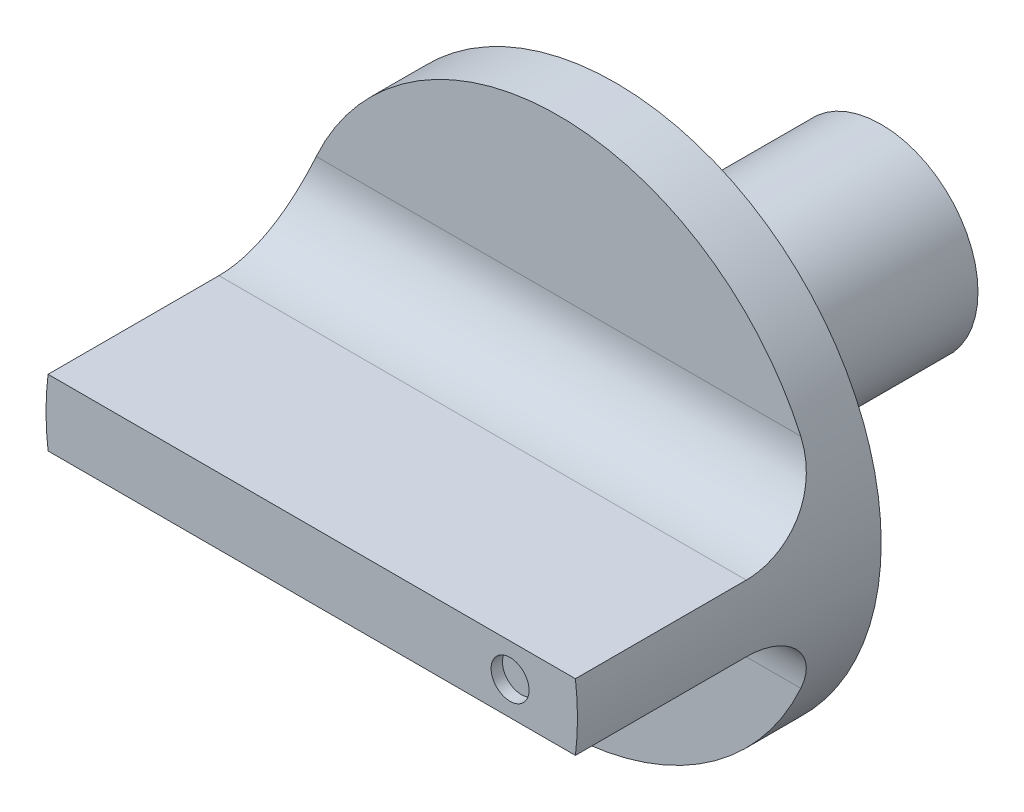
ISO-10303-21;
HEADER;
FILE_DESCRIPTION(('STEP AP214'),'2;1');
FILE_NAME('part.step','',(''),(''),'','','');
FILE_SCHEMA(('AUTOMOTIVE_DESIGN { 1 0 10303 214 1 1 1 1 }'));
ENDSEC;
DATA;
#1=APPLICATION_CONTEXT('core data for automotive mechanical design processes');
#2=APPLICATION_PROTOCOL_DEFINITION('international standard','automotive_design',2000,#1);
#3=PRODUCT_CONTEXT('',#1,'mechanical');
#4=PRODUCT('Part','Part','',(#3));
#5=PRODUCT_RELATED_PRODUCT_CATEGORY('part','',(#4));
#6=PRODUCT_DEFINITION_FORMATION('','',#4);
#7=PRODUCT_DEFINITION_CONTEXT('part definition',#1,'design');
#8=PRODUCT_DEFINITION('design','',#6,#7);
#9=PRODUCT_DEFINITION_SHAPE('','',#8);
#10=(LENGTH_UNIT() NAMED_UNIT(*) SI_UNIT(.MILLI.,.METRE.));
#11=(NAMED_UNIT(*) PLANE_ANGLE_UNIT() SI_UNIT($,.RADIAN.));
#12=(NAMED_UNIT(*) SI_UNIT($,.STERADIAN.) SOLID_ANGLE_UNIT());
#13=UNCERTAINTY_MEASURE_WITH_UNIT(LENGTH_MEASURE(1.E-05),#10,'distance_accuracy_value','');
#14=(GEOMETRIC_REPRESENTATION_CONTEXT(3) GLOBAL_UNCERTAINTY_ASSIGNED_CONTEXT((#13)) GLOBAL_UNIT_ASSIGNED_CONTEXT((#10,
#11,#12)) REPRESENTATION_CONTEXT('',''));
#15=CARTESIAN_POINT('',(0.,0.,0.));
#16=DIRECTION('',(0.,0.,1.));
#17=DIRECTION('',(1.,0.,0.));
#18=AXIS2_PLACEMENT_3D('',#15,#16,#17);
#19=CARTESIAN_POINT('',(0.,0.,0.));
#20=DIRECTION('',(0.,0.,1.));
#21=DIRECTION('',(1.,0.,0.));
#22=AXIS2_PLACEMENT_3D('',#19,#20,#21);
#23=PLANE('',#22);
#24=CARTESIAN_POINT('',(0.,0.,0.));
#25=DIRECTION('',(0.,0.,1.));
#26=DIRECTION('',(1.,0.,0.));
#27=AXIS2_PLACEMENT_3D('',#24,#25,#26);
#28=CIRCLE('',#27,8.1);
#29=CARTESIAN_POINT('',(8.1,0.,0.));
#30=VERTEX_POINT('',#29);
#31=EDGE_CURVE('E11',#30,#30,#28,.T.);
#32=ORIENTED_EDGE('',*,*,#31,.T.);
#33=EDGE_LOOP('',(#32));
#34=FACE_BOUND('',#33,.T.);
#35=CARTESIAN_POINT('',(0.,0.,0.));
#36=DIRECTION('',(0.,0.,1.));
#37=DIRECTION('',(1.,0.,0.));
#38=AXIS2_PLACEMENT_3D('',#35,#36,#37);
#39=CIRCLE('',#38,14.);
#40=CARTESIAN_POINT('',(14.,0.,0.));
#41=VERTEX_POINT('',#40);
#42=EDGE_CURVE('E143',#41,#41,#39,.T.);
#43=ORIENTED_EDGE('',*,*,#42,.F.);
#44=EDGE_LOOP('',(#43));
#45=FACE_BOUND('',#44,.T.);
#46=ADVANCED_FACE('F37',(#34,#45),#23,.F.);
#47=CARTESIAN_POINT('',(0.,0.,3.));
#48=DIRECTION('',(0.,0.,1.));
#49=DIRECTION('',(1.,0.,0.));
#50=AXIS2_PLACEMENT_3D('',#47,#48,#49);
#51=PLANE('',#50);
#52=CARTESIAN_POINT('',(0.,0.,3.));
#53=DIRECTION('',(0.,0.,1.));
#54=DIRECTION('',(1.,0.,0.));
#55=AXIS2_PLACEMENT_3D('',#52,#53,#54);
#56=CIRCLE('',#55,14.);
#57=CARTESIAN_POINT('',(12.7646974112197,5.75,3.));
#58=VERTEX_POINT('',#57);
#59=CARTESIAN_POINT('',(-12.7646974112197,5.75,3.));
#60=VERTEX_POINT('',#59);
#61=EDGE_CURVE('E154',#58,#60,#56,.T.);
#62=ORIENTED_EDGE('',*,*,#61,.T.);
#63=DIRECTION('',(-1.,0.,0.));
#64=VECTOR('',#63,1.);
#65=CARTESIAN_POINT('',(0.,5.75,3.));
#66=LINE('',#65,#64);
#67=EDGE_CURVE('E58',#60,#58,#66,.F.);
#68=ORIENTED_EDGE('',*,*,#67,.T.);
#69=EDGE_LOOP('',(#62,#68));
#70=FACE_BOUND('',#69,.T.);
#71=ADVANCED_FACE('F226',(#70),#51,.T.);
#72=CARTESIAN_POINT('',(0.,0.,3.));
#73=DIRECTION('',(0.,0.,-1.));
#74=DIRECTION('',(-1.,0.,0.));
#75=AXIS2_PLACEMENT_3D('',#72,#73,#74);
#76=CYLINDRICAL_SURFACE('',#75,14.);
#77=ORIENTED_EDGE('',*,*,#61,.F.);
#78=CARTESIAN_POINT('',(12.7646974112197,5.75,3.));
#79=CARTESIAN_POINT('',(12.8133424499844,5.64204335223538,2.99998928871641));
#80=CARTESIAN_POINT('',(12.8606029108377,5.53343825312185,3.0043706572603));
#81=CARTESIAN_POINT('',(12.9521304523054,5.31565370141964,3.02215339393863));
#82=CARTESIAN_POINT('',(12.9963962104835,5.2064740177411,3.03555871873419));
#83=CARTESIAN_POINT('',(13.0817394779418,4.98817355543458,3.07165627917164));
#84=CARTESIAN_POINT('',(13.1228114399877,4.87905319238212,3.09436426183639));
#85=CARTESIAN_POINT('',(13.2014972593165,4.66195155064684,3.14919727809361));
#86=CARTESIAN_POINT('',(13.2391116505054,4.55397009838477,3.18132085454332));
#87=CARTESIAN_POINT('',(13.3108824890513,4.33972493394002,3.2551366859237));
#88=CARTESIAN_POINT('',(13.3450277027999,4.23346768322963,3.29685868195494));
#89=CARTESIAN_POINT('',(13.4096750982265,4.02400638756288,3.38972723167851));
#90=CARTESIAN_POINT('',(13.4401773958802,3.92080224548669,3.44087348520886));
#91=CARTESIAN_POINT('',(13.4975283811932,3.71856994600999,3.55230462847356));
#92=CARTESIAN_POINT('',(13.5243817125624,3.61953659377169,3.61257769271428));
#93=CARTESIAN_POINT('',(13.5745767884513,3.42648697706038,3.74196566619452));
#94=CARTESIAN_POINT('',(13.5979187520637,3.33247039980081,3.81108002328098));
#95=CARTESIAN_POINT('',(13.6400616047314,3.15539921257272,3.9536501208695));
#96=CARTESIAN_POINT('',(13.6590416721592,3.0720260855453,4.02665784053624));
#97=CARTESIAN_POINT('',(13.6941993298864,2.91130130701874,4.179697076731));
#98=CARTESIAN_POINT('',(13.7103759690978,2.8339517039348,4.25973096312895));
#99=CARTESIAN_POINT('',(13.7401320649127,2.68597661762547,4.4262552318053));
#100=CARTESIAN_POINT('',(13.7537113800831,2.61535150067565,4.51274596532402));
#101=CARTESIAN_POINT('',(13.7785037692007,2.48142483079348,4.69155526745248));
#102=CARTESIAN_POINT('',(13.7897159941137,2.41812590930497,4.78387591177716));
#103=CARTESIAN_POINT('',(13.8197768846105,2.24227251491381,5.06505828087165));
#104=CARTESIAN_POINT('',(13.8356033516487,2.1408730483142,5.2614004982721));
#105=CARTESIAN_POINT('',(13.8607187424358,1.97175900445524,5.66829092108877));
#106=CARTESIAN_POINT('',(13.8700113757158,1.90402532013414,5.8788309912541));
#107=CARTESIAN_POINT('',(13.881303630132,1.81951457880177,6.24200420548069));
#108=CARTESIAN_POINT('',(13.8846679653311,1.79346835299963,6.39249988664667));
#109=CARTESIAN_POINT('',(13.8890975349593,1.75870711080202,6.69531316345105));
#110=CARTESIAN_POINT('',(13.8901657678749,1.74996949221797,6.84762812143153));
#111=CARTESIAN_POINT('',(13.8901943830891,1.75,7.));
#112=B_SPLINE_CURVE_WITH_KNOTS('',3,(#78,#79,#80,#81,#82,#83,#84,#85,#86,#87,#88,#89,#90,#91,
#92,#93,#94,#95,#96,#97,#98,#99,#100,#101,#102,#103,#104,#105,#106,#107,#108,#109,#110,#111),
.UNSPECIFIED.,.F.,.F.,(4,2,2,2,2,2,2,2,2,2,2,2,2,2,2,2,4),(0.,0.355173118166567,
0.71050206773962,1.06643500023452,1.42231287815554,1.77930867520821,2.13629310393352,
2.49281888884011,2.84932241899327,3.18621306732474,3.52321778599072,3.86024085045587,
4.19738459460411,4.85867106402948,5.519581789605,5.97693088002772,6.43368235318159),.UNSPECIFIED.);
#113=CARTESIAN_POINT('',(13.8901943830891,1.75,7.));
#114=VERTEX_POINT('',#113);
#115=EDGE_CURVE('E204',#58,#114,#112,.T.);
#116=ORIENTED_EDGE('',*,*,#115,.T.);
#117=DIRECTION('',(0.,0.,-1.));
#118=VECTOR('',#117,1.);
#119=CARTESIAN_POINT('',(13.8901943830891,1.75,16.));
#120=LINE('',#119,#118);
#121=CARTESIAN_POINT('',(13.8901943830891,1.75,16.));
#122=VERTEX_POINT('',#121);
#123=EDGE_CURVE('E278',#122,#114,#120,.T.);
#124=ORIENTED_EDGE('',*,*,#123,.F.);
#125=CARTESIAN_POINT('',(0.,0.,16.));
#126=DIRECTION('',(0.,0.,1.));
#127=DIRECTION('',(1.,0.,0.));
#128=AXIS2_PLACEMENT_3D('',#125,#126,#127);
#129=CIRCLE('',#128,14.);
#130=CARTESIAN_POINT('',(13.8901943830891,-1.75,16.));
#131=VERTEX_POINT('',#130);
#132=EDGE_CURVE('E138',#131,#122,#129,.T.);
#133=ORIENTED_EDGE('',*,*,#132,.F.);
#134=DIRECTION('',(0.,0.,-1.));
#135=VECTOR('',#134,1.);
#136=CARTESIAN_POINT('',(13.8901943830891,-1.75,16.));
#137=LINE('',#136,#135);
#138=CARTESIAN_POINT('',(13.8901943830891,-1.75,7.));
#139=VERTEX_POINT('',#138);
#140=EDGE_CURVE('E150',#131,#139,#137,.T.);
#141=ORIENTED_EDGE('',*,*,#140,.T.);
#142=CARTESIAN_POINT('',(13.8901943830891,-1.75,7.));
#143=CARTESIAN_POINT('',(13.890185903272,-1.74998758259612,6.88866587409843));
#144=CARTESIAN_POINT('',(13.889608507661,-1.75464771532613,6.77733304978259));
#145=CARTESIAN_POINT('',(13.8872545703268,-1.77322381971045,6.55545803267385));
#146=CARTESIAN_POINT('',(13.8854780627,-1.78713952818524,6.44491581749054));
#147=CARTESIAN_POINT('',(13.880665882577,-1.82412762233876,6.22546242215585));
#148=CARTESIAN_POINT('',(13.8776308851174,-1.84719509884925,6.11655039999122));
#149=CARTESIAN_POINT('',(13.8701837297043,-1.90230941575159,5.90107230724183));
#150=CARTESIAN_POINT('',(13.8657715943786,-1.93435610860528,5.79450619814222));
#151=CARTESIAN_POINT('',(13.855413758154,-2.00720229493654,5.58443282668332));
#152=CARTESIAN_POINT('',(13.8494673900458,-2.0480055951979,5.48092691703054));
#153=CARTESIAN_POINT('',(13.8358514398742,-2.13805714759255,5.2777274057792));
#154=CARTESIAN_POINT('',(13.8281812226378,-2.18730851092858,5.1780352252798));
#155=CARTESIAN_POINT('',(13.8109115224595,-2.29382440731986,4.98327946680829));
#156=CARTESIAN_POINT('',(13.8013131867418,-2.35108416927841,4.88821317803191));
#157=CARTESIAN_POINT('',(13.7799539983247,-2.47319820911891,4.70329566988036));
#158=CARTESIAN_POINT('',(13.7681923569512,-2.53805525359262,4.61344636822533));
#159=CARTESIAN_POINT('',(13.7423436759324,-2.67446883008973,4.44007539930171));
#160=CARTESIAN_POINT('',(13.7282684914239,-2.74599044142749,4.35652448661875));
#161=CARTESIAN_POINT('',(13.6975289047743,-2.89543111551641,4.19581008422588));
#162=CARTESIAN_POINT('',(13.6808635546214,-2.9733525156743,4.11864894911535));
#163=CARTESIAN_POINT('',(13.6447612739288,-3.13485734846068,3.9713088230282));
#164=CARTESIAN_POINT('',(13.6253259441231,-3.21843749643201,3.9011258389641));
#165=CARTESIAN_POINT('',(13.5835051904724,-3.39060996063691,3.76810933959038));
#166=CARTESIAN_POINT('',(13.5611186957287,-3.47920408961771,3.70527850787764));
#167=CARTESIAN_POINT('',(13.513391327788,-3.66018714482122,3.58762886938527));
#168=CARTESIAN_POINT('',(13.4880647397794,-3.75255641717657,3.53277401668241));
#169=CARTESIAN_POINT('',(13.4342943534781,-3.94072512299216,3.4309702623758));
#170=CARTESIAN_POINT('',(13.4058493949619,-4.03652582416611,3.3840243199596));
#171=CARTESIAN_POINT('',(13.3458230422065,-4.23076041808268,3.2982190730414));
#172=CARTESIAN_POINT('',(13.3142409679559,-4.32919487833409,3.25936152748179));
#173=CARTESIAN_POINT('',(13.24798601634,-4.52789819168774,3.18980785800911));
#174=CARTESIAN_POINT('',(13.2133121728158,-4.62816761036863,3.1591142973097));
#175=CARTESIAN_POINT('',(13.1162936594352,-4.89848299299658,3.08776470183214));
#176=CARTESIAN_POINT('',(13.0511759463316,-5.06957848692445,3.05454308171097));
#177=CARTESIAN_POINT('',(12.947810115637,-5.32566664340295,3.02163845443137));
#178=CARTESIAN_POINT('',(12.9124400681924,-5.41086252052081,3.01349129441037));
#179=CARTESIAN_POINT('',(12.8398964948102,-5.58082349877243,3.00267398153743));
#180=CARTESIAN_POINT('',(12.8027231701248,-5.66558864681592,3.00000321893317));
#181=CARTESIAN_POINT('',(12.7646974112197,-5.75,3.));
#182=B_SPLINE_CURVE_WITH_KNOTS('',3,(#142,#143,#144,#145,#146,#147,#148,#149,#150,#151,#152,
#153,#154,#155,#156,#157,#158,#159,#160,#161,#162,#163,#164,#165,#166,#167,#168,#169,#170,#171,
#172,#173,#174,#175,#176,#177,#178,#179,#180,#181),.UNSPECIFIED.,.F.,.F.,(4,2,2,2,2,2,2,2,2,2,2,
2,2,2,2,2,2,2,2,4),(0.,0.333901638520549,0.667793783054302,1.00150706364846,1.33521486129735,
1.66906802759402,2.00304440837511,2.33682265973875,2.67072283835595,3.00296252356278,
3.33532409754742,3.66749437722826,3.99978552610337,4.33052487360657,4.66138769658836,
4.99232239562323,5.32336087458255,5.87967412396052,6.15734509600004,6.43498514995604),.UNSPECIFIED.);
#183=CARTESIAN_POINT('',(12.7646974112197,-5.75,3.));
#184=VERTEX_POINT('',#183);
#185=EDGE_CURVE('E170',#139,#184,#182,.T.);
#186=ORIENTED_EDGE('',*,*,#185,.T.);
#187=CARTESIAN_POINT('',(-12.7646974112197,-5.75,3.));
#188=VERTEX_POINT('',#187);
#189=EDGE_CURVE('E146',#188,#184,#56,.T.);
#190=ORIENTED_EDGE('',*,*,#189,.F.);
#191=CARTESIAN_POINT('',(-12.7646974112197,-5.75,3.));
#192=CARTESIAN_POINT('',(-12.8133424499844,-5.64204335223538,2.99998928871641));
#193=CARTESIAN_POINT('',(-12.8606029108377,-5.53343825312185,3.0043706572603));
#194=CARTESIAN_POINT('',(-12.9521304523054,-5.31565370141964,3.02215339393863));
#195=CARTESIAN_POINT('',(-12.9963962104835,-5.2064740177411,3.03555871873419));
#196=CARTESIAN_POINT('',(-13.0817394779418,-4.98817355543458,3.07165627917164));
#197=CARTESIAN_POINT('',(-13.1228114399877,-4.87905319238212,3.09436426183639));
#198=CARTESIAN_POINT('',(-13.2014972593165,-4.66195155064684,3.14919727809361));
#199=CARTESIAN_POINT('',(-13.2391116505054,-4.55397009838477,3.18132085454332));
#200=CARTESIAN_POINT('',(-13.3108824890513,-4.33972493394002,3.2551366859237));
#201=CARTESIAN_POINT('',(-13.3450277027999,-4.23346768322963,3.29685868195494));
#202=CARTESIAN_POINT('',(-13.4096750982265,-4.02400638756288,3.38972723167851));
#203=CARTESIAN_POINT('',(-13.4401773958802,-3.92080224548669,3.44087348520886));
#204=CARTESIAN_POINT('',(-13.4975283811932,-3.71856994600999,3.55230462847356));
#205=CARTESIAN_POINT('',(-13.5243817125624,-3.61953659377169,3.61257769271428));
#206=CARTESIAN_POINT('',(-13.5745767884513,-3.42648697706038,3.74196566619452));
#207=CARTESIAN_POINT('',(-13.5979187520637,-3.33247039980081,3.81108002328098));
#208=CARTESIAN_POINT('',(-13.6400616047314,-3.15539921257272,3.9536501208695));
#209=CARTESIAN_POINT('',(-13.6590416721592,-3.0720260855453,4.02665784053624));
#210=CARTESIAN_POINT('',(-13.6941993298864,-2.91130130701874,4.179697076731));
#211=CARTESIAN_POINT('',(-13.7103759690978,-2.8339517039348,4.25973096312895));
#212=CARTESIAN_POINT('',(-13.7401320649127,-2.68597661762547,4.4262552318053));
#213=CARTESIAN_POINT('',(-13.7537113800831,-2.61535150067565,4.51274596532402));
#214=CARTESIAN_POINT('',(-13.7785037692007,-2.48142483079348,4.69155526745248));
#215=CARTESIAN_POINT('',(-13.7897159941137,-2.41812590930497,4.78387591177716));
#216=CARTESIAN_POINT('',(-13.8197768846105,-2.24227251491381,5.06505828087165));
#217=CARTESIAN_POINT('',(-13.8356033516487,-2.1408730483142,5.2614004982721));
#218=CARTESIAN_POINT('',(-13.8607187424358,-1.97175900445524,5.66829092108877));
#219=CARTESIAN_POINT('',(-13.8700113757158,-1.90402532013414,5.8788309912541));
#220=CARTESIAN_POINT('',(-13.881303630132,-1.81951457880177,6.24200420548069));
#221=CARTESIAN_POINT('',(-13.8846679653311,-1.79346835299963,6.39249988664667));
#222=CARTESIAN_POINT('',(-13.8890975349593,-1.75870711080202,6.69531316345105));
#223=CARTESIAN_POINT('',(-13.8901657678749,-1.74996949221797,6.84762812143153));
#224=CARTESIAN_POINT('',(-13.8901943830891,-1.75,7.));
#225=B_SPLINE_CURVE_WITH_KNOTS('',3,(#191,#192,#193,#194,#195,#196,#197,#198,#199,#200,#201,
#202,#203,#204,#205,#206,#207,#208,#209,#210,#211,#212,#213,#214,#215,#216,#217,#218,#219,#220,
#221,#222,#223,#224),.UNSPECIFIED.,.F.,.F.,(4,2,2,2,2,2,2,2,2,2,2,2,2,2,2,2,4),(0.,
0.355173118166567,0.71050206773962,1.06643500023452,1.42231287815554,1.77930867520821,
2.13629310393352,2.49281888884011,2.84932241899327,3.18621306732474,3.52321778599072,
3.86024085045587,4.19738459460411,4.85867106402948,5.519581789605,5.97693088002772,
6.43368235318159),.UNSPECIFIED.);
#226=CARTESIAN_POINT('',(-13.8901943830891,-1.75,7.));
#227=VERTEX_POINT('',#226);
#228=EDGE_CURVE('E171',#188,#227,#225,.T.);
#229=ORIENTED_EDGE('',*,*,#228,.T.);
#230=DIRECTION('',(0.,0.,-1.));
#231=VECTOR('',#230,1.);
#232=CARTESIAN_POINT('',(-13.8901943830891,-1.75,16.));
#233=LINE('',#232,#231);
#234=CARTESIAN_POINT('',(-13.8901943830891,-1.75,16.));
#235=VERTEX_POINT('',#234);
#236=EDGE_CURVE('E147',#235,#227,#233,.T.);
#237=ORIENTED_EDGE('',*,*,#236,.F.);
#238=CARTESIAN_POINT('',(0.,0.,16.));
#239=DIRECTION('',(0.,0.,1.));
#240=DIRECTION('',(1.,0.,0.));
#241=AXIS2_PLACEMENT_3D('',#238,#239,#240);
#242=CIRCLE('',#241,14.);
#243=CARTESIAN_POINT('',(-13.8901943830891,1.75,16.));
#244=VERTEX_POINT('',#243);
#245=EDGE_CURVE('E133',#244,#235,#242,.T.);
#246=ORIENTED_EDGE('',*,*,#245,.F.);
#247=DIRECTION('',(0.,0.,-1.));
#248=VECTOR('',#247,1.);
#249=CARTESIAN_POINT('',(-13.8901943830891,1.75,16.));
#250=LINE('',#249,#248);
#251=CARTESIAN_POINT('',(-13.8901943830891,1.75,7.));
#252=VERTEX_POINT('',#251);
#253=EDGE_CURVE('E142',#244,#252,#250,.T.);
#254=ORIENTED_EDGE('',*,*,#253,.T.);
#255=CARTESIAN_POINT('',(-13.8901943830891,1.75,7.));
#256=CARTESIAN_POINT('',(-13.890185903272,1.74998758259612,6.88866587409843));
#257=CARTESIAN_POINT('',(-13.889608507661,1.75464771532613,6.77733304978259));
#258=CARTESIAN_POINT('',(-13.8872545703268,1.77322381971045,6.55545803267385));
#259=CARTESIAN_POINT('',(-13.8854780627,1.78713952818524,6.44491581749054));
#260=CARTESIAN_POINT('',(-13.880665882577,1.82412762233876,6.22546242215585));
#261=CARTESIAN_POINT('',(-13.8776308851174,1.84719509884925,6.11655039999122));
#262=CARTESIAN_POINT('',(-13.8701837297043,1.90230941575159,5.90107230724183));
#263=CARTESIAN_POINT('',(-13.8657715943786,1.93435610860528,5.79450619814222));
#264=CARTESIAN_POINT('',(-13.855413758154,2.00720229493654,5.58443282668332));
#265=CARTESIAN_POINT('',(-13.8494673900458,2.0480055951979,5.48092691703054));
#266=CARTESIAN_POINT('',(-13.8358514398742,2.13805714759255,5.2777274057792));
#267=CARTESIAN_POINT('',(-13.8281812226378,2.18730851092858,5.1780352252798));
#268=CARTESIAN_POINT('',(-13.8109115224595,2.29382440731986,4.98327946680829));
#269=CARTESIAN_POINT('',(-13.8013131867418,2.35108416927841,4.88821317803191));
#270=CARTESIAN_POINT('',(-13.7799539983247,2.47319820911891,4.70329566988036));
#271=CARTESIAN_POINT('',(-13.7681923569512,2.53805525359262,4.61344636822533));
#272=CARTESIAN_POINT('',(-13.7423436759324,2.67446883008973,4.44007539930171));
#273=CARTESIAN_POINT('',(-13.7282684914239,2.74599044142749,4.35652448661875));
#274=CARTESIAN_POINT('',(-13.6975289047743,2.89543111551641,4.19581008422588));
#275=CARTESIAN_POINT('',(-13.6808635546214,2.9733525156743,4.11864894911535));
#276=CARTESIAN_POINT('',(-13.6447612739288,3.13485734846068,3.9713088230282));
#277=CARTESIAN_POINT('',(-13.6253259441231,3.21843749643201,3.9011258389641));
#278=CARTESIAN_POINT('',(-13.5835051904724,3.39060996063691,3.76810933959038));
#279=CARTESIAN_POINT('',(-13.5611186957287,3.47920408961771,3.70527850787764));
#280=CARTESIAN_POINT('',(-13.513391327788,3.66018714482122,3.58762886938527));
#281=CARTESIAN_POINT('',(-13.4880647397794,3.75255641717657,3.53277401668241));
#282=CARTESIAN_POINT('',(-13.4342943534781,3.94072512299216,3.4309702623758));
#283=CARTESIAN_POINT('',(-13.4058493949619,4.03652582416611,3.3840243199596));
#284=CARTESIAN_POINT('',(-13.3458230422065,4.23076041808268,3.2982190730414));
#285=CARTESIAN_POINT('',(-13.3142409679559,4.32919487833409,3.25936152748179));
#286=CARTESIAN_POINT('',(-13.24798601634,4.52789819168774,3.18980785800911));
#287=CARTESIAN_POINT('',(-13.2133121728158,4.62816761036863,3.1591142973097));
#288=CARTESIAN_POINT('',(-13.1162936594352,4.89848299299658,3.08776470183214));
#289=CARTESIAN_POINT('',(-13.0511759463316,5.06957848692445,3.05454308171097));
#290=CARTESIAN_POINT('',(-12.947810115637,5.32566664340295,3.02163845443137));
#291=CARTESIAN_POINT('',(-12.9124400681924,5.41086252052081,3.01349129441037));
#292=CARTESIAN_POINT('',(-12.8398964948102,5.58082349877243,3.00267398153743));
#293=CARTESIAN_POINT('',(-12.8027231701248,5.66558864681592,3.00000321893317));
#294=CARTESIAN_POINT('',(-12.7646974112197,5.75,3.));
#295=B_SPLINE_CURVE_WITH_KNOTS('',3,(#255,#256,#257,#258,#259,#260,#261,#262,#263,#264,#265,
#266,#267,#268,#269,#270,#271,#272,#273,#274,#275,#276,#277,#278,#279,#280,#281,#282,#283,#284,
#285,#286,#287,#288,#289,#290,#291,#292,#293,#294),.UNSPECIFIED.,.F.,.F.,(4,2,2,2,2,2,2,2,2,2,2,
2,2,2,2,2,2,2,2,4),(0.,0.333901638520549,0.667793783054302,1.00150706364846,1.33521486129735,
1.66906802759402,2.00304440837511,2.33682265973875,2.67072283835595,3.00296252356278,
3.33532409754742,3.66749437722826,3.99978552610337,4.33052487360657,4.66138769658836,
4.99232239562323,5.32336087458255,5.87967412396052,6.15734509600004,6.43498514995604),.UNSPECIFIED.);
#296=EDGE_CURVE('E52',#252,#60,#295,.T.);
#297=ORIENTED_EDGE('',*,*,#296,.T.);
#298=EDGE_LOOP('',(#77,#116,#124,#133,#141,#186,#190,#229,#237,#246,#254,#297));
#299=FACE_BOUND('',#298,.T.);
#300=ORIENTED_EDGE('',*,*,#42,.T.);
#301=EDGE_LOOP('',(#300));
#302=FACE_BOUND('',#301,.T.);
#303=ADVANCED_FACE('F185',(#299,#302),#76,.T.);
#304=ORIENTED_EDGE('',*,*,#189,.T.);
#305=DIRECTION('',(1.,0.,0.));
#306=VECTOR('',#305,1.);
#307=CARTESIAN_POINT('',(0.,-5.75,3.));
#308=LINE('',#307,#306);
#309=EDGE_CURVE('E163',#184,#188,#308,.F.);
#310=ORIENTED_EDGE('',*,*,#309,.T.);
#311=EDGE_LOOP('',(#304,#310));
#312=FACE_BOUND('',#311,.T.);
#313=ADVANCED_FACE('F232',(#312),#51,.T.);
#314=CARTESIAN_POINT('',(-13.8901943830891,-1.75,16.));
#315=DIRECTION('',(0.,1.,0.));
#316=DIRECTION('',(0.,0.,1.));
#317=AXIS2_PLACEMENT_3D('',#314,#315,#316);
#318=PLANE('',#317);
#319=ORIENTED_EDGE('',*,*,#236,.T.);
#320=DIRECTION('',(1.,0.,0.));
#321=VECTOR('',#320,1.);
#322=CARTESIAN_POINT('',(-13.8901943830891,-1.75,7.));
#323=LINE('',#322,#321);
#324=EDGE_CURVE('E161',#227,#139,#323,.T.);
#325=ORIENTED_EDGE('',*,*,#324,.T.);
#326=ORIENTED_EDGE('',*,*,#140,.F.);
#327=DIRECTION('',(1.,0.,0.));
#328=VECTOR('',#327,1.);
#329=CARTESIAN_POINT('',(-13.8901943830891,-1.75,16.));
#330=LINE('',#329,#328);
#331=EDGE_CURVE('E136',#235,#131,#330,.T.);
#332=ORIENTED_EDGE('',*,*,#331,.F.);
#333=EDGE_LOOP('',(#319,#325,#326,#332));
#334=FACE_BOUND('',#333,.T.);
#335=ADVANCED_FACE('F258',(#334),#318,.F.);
#336=CARTESIAN_POINT('',(-13.8901943830891,1.75,16.));
#337=DIRECTION('',(0.,-1.,0.));
#338=DIRECTION('',(0.,0.,-1.));
#339=AXIS2_PLACEMENT_3D('',#336,#337,#338);
#340=PLANE('',#339);
#341=ORIENTED_EDGE('',*,*,#123,.T.);
#342=DIRECTION('',(-1.,0.,0.));
#343=VECTOR('',#342,1.);
#344=CARTESIAN_POINT('',(-13.8901943830891,1.75,7.));
#345=LINE('',#344,#343);
#346=EDGE_CURVE('E164',#114,#252,#345,.T.);
#347=ORIENTED_EDGE('',*,*,#346,.T.);
#348=ORIENTED_EDGE('',*,*,#253,.F.);
#349=DIRECTION('',(-1.,0.,0.));
#350=VECTOR('',#349,1.);
#351=CARTESIAN_POINT('',(-13.8901943830891,1.75,16.));
#352=LINE('',#351,#350);
#353=EDGE_CURVE('E140',#122,#244,#352,.T.);
#354=ORIENTED_EDGE('',*,*,#353,.F.);
#355=EDGE_LOOP('',(#341,#347,#348,#354));
#356=FACE_BOUND('',#355,.T.);
#357=ADVANCED_FACE('F254',(#356),#340,.F.);
#358=CARTESIAN_POINT('',(0.,0.,16.));
#359=DIRECTION('',(0.,0.,1.));
#360=DIRECTION('',(1.,0.,0.));
#361=AXIS2_PLACEMENT_3D('',#358,#359,#360);
#362=PLANE('',#361);
#363=CARTESIAN_POINT('',(10.4486518787609,0.,16.));
#364=DIRECTION('',(0.,0.,1.));
#365=DIRECTION('',(1.,0.,0.));
#366=AXIS2_PLACEMENT_3D('',#363,#364,#365);
#367=CIRCLE('',#366,1.);
#368=CARTESIAN_POINT('',(11.4486518787609,0.,16.));
#369=VERTEX_POINT('',#368);
#370=EDGE_CURVE('E124',#369,#369,#367,.T.);
#371=ORIENTED_EDGE('',*,*,#370,.F.);
#372=EDGE_LOOP('',(#371));
#373=FACE_BOUND('',#372,.T.);
#374=ORIENTED_EDGE('',*,*,#245,.T.);
#375=ORIENTED_EDGE('',*,*,#331,.T.);
#376=ORIENTED_EDGE('',*,*,#132,.T.);
#377=ORIENTED_EDGE('',*,*,#353,.T.);
#378=EDGE_LOOP('',(#374,#375,#376,#377));
#379=FACE_BOUND('',#378,.T.);
#380=ADVANCED_FACE('F248',(#373,#379),#362,.T.);
#381=CARTESIAN_POINT('',(0.,0.,-14.));
#382=DIRECTION('',(0.,0.,-1.));
#383=DIRECTION('',(-1.,0.,0.));
#384=AXIS2_PLACEMENT_3D('',#381,#382,#383);
#385=PLANE('',#384);
#386=CARTESIAN_POINT('',(0.,0.,-14.));
#387=DIRECTION('',(0.,0.,-1.));
#388=DIRECTION('',(-1.,0.,0.));
#389=AXIS2_PLACEMENT_3D('',#386,#387,#388);
#390=CIRCLE('',#389,5.1);
#391=CARTESIAN_POINT('',(-5.1,0.,-14.));
#392=VERTEX_POINT('',#391);
#393=EDGE_CURVE('E130',#392,#392,#390,.T.);
#394=ORIENTED_EDGE('',*,*,#393,.T.);
#395=EDGE_LOOP('',(#394));
#396=FACE_BOUND('',#395,.T.);
#397=DIRECTION('',(0.,-1.,0.));
#398=VECTOR('',#397,1.);
#399=CARTESIAN_POINT('',(1.1,2.89827534923789,-14.));
#400=LINE('',#399,#398);
#401=CARTESIAN_POINT('',(1.1,2.89827534923789,-14.));
#402=VERTEX_POINT('',#401);
#403=CARTESIAN_POINT('',(1.1,-2.89827534923789,-14.));
#404=VERTEX_POINT('',#403);
#405=EDGE_CURVE('E101',#402,#404,#400,.T.);
#406=ORIENTED_EDGE('',*,*,#405,.F.);
#407=CARTESIAN_POINT('',(0.,0.,-14.));
#408=DIRECTION('',(0.,0.,-1.));
#409=DIRECTION('',(-1.,0.,0.));
#410=AXIS2_PLACEMENT_3D('',#407,#408,#409);
#411=CIRCLE('',#410,3.1);
#412=EDGE_CURVE('E111',#404,#402,#411,.T.);
#413=ORIENTED_EDGE('',*,*,#412,.F.);
#414=EDGE_LOOP('',(#406,#413));
#415=FACE_BOUND('',#414,.T.);
#416=ADVANCED_FACE('F119',(#396,#415),#385,.T.);
#417=CARTESIAN_POINT('',(0.,0.,-14.));
#418=DIRECTION('',(0.,0.,1.));
#419=DIRECTION('',(1.,0.,0.));
#420=AXIS2_PLACEMENT_3D('',#417,#418,#419);
#421=CYLINDRICAL_SURFACE('',#420,5.1);
#422=CARTESIAN_POINT('',(0.,0.,-3.));
#423=DIRECTION('',(0.,0.,1.));
#424=DIRECTION('',(1.,0.,0.));
#425=AXIS2_PLACEMENT_3D('',#422,#423,#424);
#426=CIRCLE('',#425,5.1);
#427=CARTESIAN_POINT('',(5.1,0.,-3.));
#428=VERTEX_POINT('',#427);
#429=EDGE_CURVE('E45',#428,#428,#426,.F.);
#430=ORIENTED_EDGE('',*,*,#429,.T.);
#431=EDGE_LOOP('',(#430));
#432=FACE_BOUND('',#431,.T.);
#433=ORIENTED_EDGE('',*,*,#393,.F.);
#434=EDGE_LOOP('',(#433));
#435=FACE_BOUND('',#434,.T.);
#436=ADVANCED_FACE('F212',(#432,#435),#421,.T.);
#437=CARTESIAN_POINT('',(0.,0.,-14.));
#438=DIRECTION('',(0.,0.,1.));
#439=DIRECTION('',(1.,0.,0.));
#440=AXIS2_PLACEMENT_3D('',#437,#438,#439);
#441=CYLINDRICAL_SURFACE('',#440,3.1);
#442=CARTESIAN_POINT('',(0.,0.,0.));
#443=DIRECTION('',(0.,0.,-1.));
#444=DIRECTION('',(-1.,0.,0.));
#445=AXIS2_PLACEMENT_3D('',#442,#443,#444);
#446=CIRCLE('',#445,3.1);
#447=CARTESIAN_POINT('',(1.1,-2.89827534923789,0.));
#448=VERTEX_POINT('',#447);
#449=CARTESIAN_POINT('',(1.1,2.89827534923789,0.));
#450=VERTEX_POINT('',#449);
#451=EDGE_CURVE('E116',#448,#450,#446,.T.);
#452=ORIENTED_EDGE('',*,*,#451,.F.);
#453=DIRECTION('',(0.,0.,1.));
#454=VECTOR('',#453,1.);
#455=CARTESIAN_POINT('',(1.1,-2.89827534923789,-14.));
#456=LINE('',#455,#454);
#457=EDGE_CURVE('E104',#404,#448,#456,.T.);
#458=ORIENTED_EDGE('',*,*,#457,.F.);
#459=ORIENTED_EDGE('',*,*,#412,.T.);
#460=DIRECTION('',(0.,0.,1.));
#461=VECTOR('',#460,1.);
#462=CARTESIAN_POINT('',(1.1,2.89827534923789,-14.));
#463=LINE('',#462,#461);
#464=EDGE_CURVE('E107',#402,#450,#463,.T.);
#465=ORIENTED_EDGE('',*,*,#464,.T.);
#466=EDGE_LOOP('',(#452,#458,#459,#465));
#467=FACE_BOUND('',#466,.T.);
#468=ADVANCED_FACE('F114',(#467),#441,.F.);
#469=CARTESIAN_POINT('',(1.1,2.89827534923789,-14.));
#470=DIRECTION('',(-1.,0.,0.));
#471=DIRECTION('',(0.,0.,1.));
#472=AXIS2_PLACEMENT_3D('',#469,#470,#471);
#473=PLANE('',#472);
#474=DIRECTION('',(0.,-1.,0.));
#475=VECTOR('',#474,1.);
#476=CARTESIAN_POINT('',(1.1,2.89827534923789,0.));
#477=LINE('',#476,#475);
#478=EDGE_CURVE('E120',#450,#448,#477,.T.);
#479=ORIENTED_EDGE('',*,*,#478,.F.);
#480=ORIENTED_EDGE('',*,*,#464,.F.);
#481=ORIENTED_EDGE('',*,*,#405,.T.);
#482=ORIENTED_EDGE('',*,*,#457,.T.);
#483=EDGE_LOOP('',(#479,#480,#481,#482));
#484=FACE_BOUND('',#483,.T.);
#485=ADVANCED_FACE('F103',(#484),#473,.T.);
#486=ORIENTED_EDGE('',*,*,#478,.T.);
#487=ORIENTED_EDGE('',*,*,#451,.T.);
#488=EDGE_LOOP('',(#486,#487));
#489=FACE_BOUND('',#488,.T.);
#490=ADVANCED_FACE('F192',(#489),#23,.F.);
#491=CARTESIAN_POINT('',(-13.8901943830891,-5.75,7.));
#492=DIRECTION('',(1.,0.,0.));
#493=DIRECTION('',(0.,0.,-1.));
#494=AXIS2_PLACEMENT_3D('',#491,#492,#493);
#495=CYLINDRICAL_SURFACE('',#494,4.);
#496=ORIENTED_EDGE('',*,*,#228,.F.);
#497=ORIENTED_EDGE('',*,*,#309,.F.);
#498=ORIENTED_EDGE('',*,*,#185,.F.);
#499=ORIENTED_EDGE('',*,*,#324,.F.);
#500=EDGE_LOOP('',(#496,#497,#498,#499));
#501=FACE_BOUND('',#500,.T.);
#502=ADVANCED_FACE('F188',(#501),#495,.F.);
#503=CARTESIAN_POINT('',(-13.8901943830891,5.75,7.));
#504=DIRECTION('',(-1.,0.,0.));
#505=DIRECTION('',(0.,0.,1.));
#506=AXIS2_PLACEMENT_3D('',#503,#504,#505);
#507=CYLINDRICAL_SURFACE('',#506,4.);
#508=ORIENTED_EDGE('',*,*,#115,.F.);
#509=ORIENTED_EDGE('',*,*,#67,.F.);
#510=ORIENTED_EDGE('',*,*,#296,.F.);
#511=ORIENTED_EDGE('',*,*,#346,.F.);
#512=EDGE_LOOP('',(#508,#509,#510,#511));
#513=FACE_BOUND('',#512,.T.);
#514=ADVANCED_FACE('F191',(#513),#507,.F.);
#515=CARTESIAN_POINT('',(0.,0.,-3.));
#516=DIRECTION('',(0.,0.,1.));
#517=DIRECTION('',(1.,0.,0.));
#518=AXIS2_PLACEMENT_3D('',#515,#516,#517);
#519=TOROIDAL_SURFACE('',#518,8.1,3.);
#520=ORIENTED_EDGE('',*,*,#31,.F.);
#521=EDGE_LOOP('',(#520));
#522=FACE_BOUND('',#521,.T.);
#523=ORIENTED_EDGE('',*,*,#429,.F.);
#524=EDGE_LOOP('',(#523));
#525=FACE_BOUND('',#524,.T.);
#526=ADVANCED_FACE('F39',(#522,#525),#519,.F.);
#527=CARTESIAN_POINT('',(10.4486518787609,0.,15.4));
#528=DIRECTION('',(0.,0.,1.));
#529=DIRECTION('',(1.,0.,0.));
#530=AXIS2_PLACEMENT_3D('',#527,#528,#529);
#531=CYLINDRICAL_SURFACE('',#530,1.);
#532=CARTESIAN_POINT('',(10.4486518787609,0.,15.4));
#533=DIRECTION('',(0.,0.,1.));
#534=DIRECTION('',(1.,0.,0.));
#535=AXIS2_PLACEMENT_3D('',#532,#533,#534);
#536=CIRCLE('',#535,1.);
#537=CARTESIAN_POINT('',(11.4486518787609,0.,15.4));
#538=VERTEX_POINT('',#537);
#539=EDGE_CURVE('E127',#538,#538,#536,.T.);
#540=ORIENTED_EDGE('',*,*,#539,.F.);
#541=EDGE_LOOP('',(#540));
#542=FACE_BOUND('',#541,.T.);
#543=ORIENTED_EDGE('',*,*,#370,.T.);
#544=EDGE_LOOP('',(#543));
#545=FACE_BOUND('',#544,.T.);
#546=ADVANCED_FACE('F216',(#542,#545),#531,.F.);
#547=CARTESIAN_POINT('',(10.4486518787609,0.,15.4));
#548=DIRECTION('',(0.,0.,1.));
#549=DIRECTION('',(1.,0.,0.));
#550=AXIS2_PLACEMENT_3D('',#547,#548,#549);
#551=PLANE('',#550);
#552=ORIENTED_EDGE('',*,*,#539,.T.);
#553=EDGE_LOOP('',(#552));
#554=FACE_BOUND('',#553,.T.);
#555=ADVANCED_FACE('F221',(#554),#551,.T.);
#556=CLOSED_SHELL('',(#46,#71,#303,#313,#335,#357,#380,#416,#436,#468,#485,#490,#502,#514,#526,
#546,#555));
#557=MANIFOLD_SOLID_BREP('B2',#556);
#558=ADVANCED_BREP_SHAPE_REPRESENTATION('',(#18,#557),#14);
#559=SHAPE_DEFINITION_REPRESENTATION(#9,#558);
ENDSEC;
END-ISO-10303-21;
